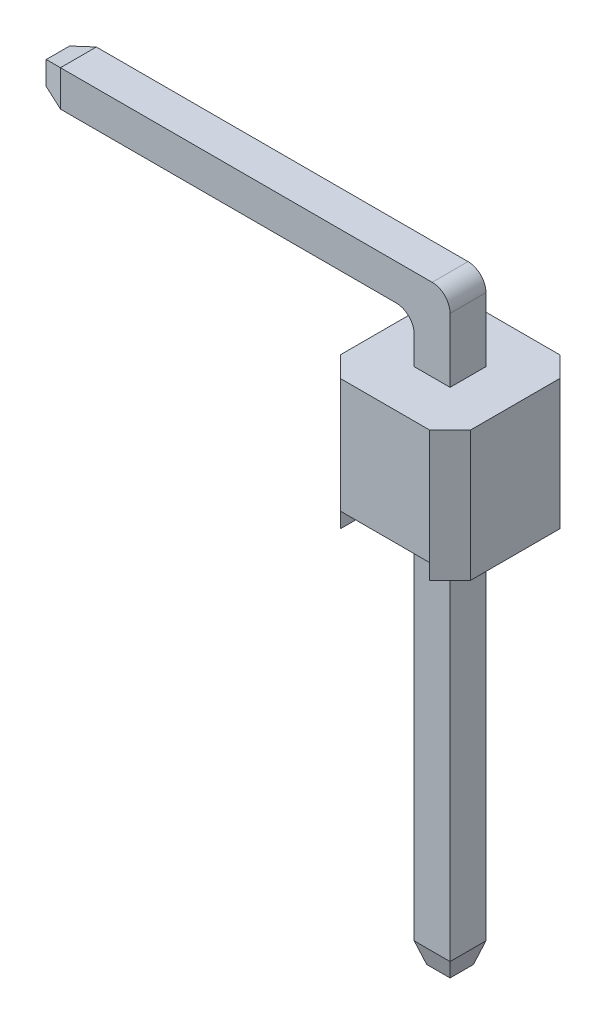
ISO-10303-21;
HEADER;
FILE_DESCRIPTION(('STEP AP214'),'2;1');
FILE_NAME('part.step','',(''),(''),'','','');
FILE_SCHEMA(('AUTOMOTIVE_DESIGN { 1 0 10303 214 1 1 1 1 }'));
ENDSEC;
DATA;
#1=APPLICATION_CONTEXT('core data for automotive mechanical design processes');
#2=APPLICATION_PROTOCOL_DEFINITION('international standard','automotive_design',2000,#1);
#3=PRODUCT_CONTEXT('',#1,'mechanical');
#4=PRODUCT('Part','Part','',(#3));
#5=PRODUCT_RELATED_PRODUCT_CATEGORY('part','',(#4));
#6=PRODUCT_DEFINITION_FORMATION('','',#4);
#7=PRODUCT_DEFINITION_CONTEXT('part definition',#1,'design');
#8=PRODUCT_DEFINITION('design','',#6,#7);
#9=PRODUCT_DEFINITION_SHAPE('','',#8);
#10=(LENGTH_UNIT() NAMED_UNIT(*) SI_UNIT(.MILLI.,.METRE.));
#11=(NAMED_UNIT(*) PLANE_ANGLE_UNIT() SI_UNIT($,.RADIAN.));
#12=(NAMED_UNIT(*) SI_UNIT($,.STERADIAN.) SOLID_ANGLE_UNIT());
#13=UNCERTAINTY_MEASURE_WITH_UNIT(LENGTH_MEASURE(1.E-05),#10,'distance_accuracy_value','');
#14=(GEOMETRIC_REPRESENTATION_CONTEXT(3) GLOBAL_UNCERTAINTY_ASSIGNED_CONTEXT((#13)) GLOBAL_UNIT_ASSIGNED_CONTEXT((#10,
#11,#12)) REPRESENTATION_CONTEXT('',''));
#15=CARTESIAN_POINT('',(0.,0.,0.));
#16=DIRECTION('',(0.,0.,1.));
#17=DIRECTION('',(1.,0.,0.));
#18=AXIS2_PLACEMENT_3D('',#15,#16,#17);
#19=CARTESIAN_POINT('',(-0.227707727417,-7.56,0.));
#20=DIRECTION('',(-0.956304755962959,-0.292371704722987,0.));
#21=DIRECTION('',(0.292371704722987,-0.956304755962959,0.));
#22=AXIS2_PLACEMENT_3D('',#19,#20,#21);
#23=PLANE('',#22);
#24=DIRECTION('',(-0.280623595141231,0.917878420979238,-0.280623595142445));
#25=VECTOR('',#24,1.);
#26=CARTESIAN_POINT('',(-0.227707727417,-7.56,-0.227707727417));
#27=LINE('',#26,#25);
#28=CARTESIAN_POINT('',(-0.227707727417,-7.56,-0.227707727417));
#29=VERTEX_POINT('',#28);
#30=CARTESIAN_POINT('',(-0.350000000000264,-7.1600000000001,-0.350000000000066));
#31=VERTEX_POINT('',#30);
#32=EDGE_CURVE('E135',#29,#31,#27,.T.);
#33=ORIENTED_EDGE('',*,*,#32,.F.);
#34=DIRECTION('',(0.,0.,-1.));
#35=VECTOR('',#34,1.);
#36=CARTESIAN_POINT('',(-0.227707727417,-7.56,0.));
#37=LINE('',#36,#35);
#38=CARTESIAN_POINT('',(-0.227707727417,-7.56,0.227707727417));
#39=VERTEX_POINT('',#38);
#40=EDGE_CURVE('E138',#39,#29,#37,.T.);
#41=ORIENTED_EDGE('',*,*,#40,.F.);
#42=DIRECTION('',(0.28062359514123,-0.917878420979238,-0.280623595142445));
#43=VECTOR('',#42,1.);
#44=CARTESIAN_POINT('',(-0.35,-7.16000000000016,0.350000000000529));
#45=LINE('',#44,#43);
#46=CARTESIAN_POINT('',(-0.350000000000264,-7.16000000000012,0.350000000000132));
#47=VERTEX_POINT('',#46);
#48=EDGE_CURVE('E152',#47,#39,#45,.T.);
#49=ORIENTED_EDGE('',*,*,#48,.F.);
#50=DIRECTION('',(0.,0.,-1.));
#51=VECTOR('',#50,1.);
#52=CARTESIAN_POINT('',(-0.35,-7.16,0.35));
#53=LINE('',#52,#51);
#54=EDGE_CURVE('E140',#47,#31,#53,.T.);
#55=ORIENTED_EDGE('',*,*,#54,.T.);
#56=EDGE_LOOP('',(#33,#41,#49,#55));
#57=FACE_BOUND('',#56,.T.);
#58=ADVANCED_FACE('F17',(#57),#23,.T.);
#59=CARTESIAN_POINT('',(0.,-7.56,-0.227707727417));
#60=DIRECTION('',(0.,-0.292371704722987,-0.956304755962959));
#61=DIRECTION('',(0.,0.956304755962959,-0.292371704722987));
#62=AXIS2_PLACEMENT_3D('',#59,#60,#61);
#63=PLANE('',#62);
#64=DIRECTION('',(0.280623595142445,0.917878420979238,-0.280623595141231));
#65=VECTOR('',#64,1.);
#66=CARTESIAN_POINT('',(0.227707727417,-7.56,-0.227707727417));
#67=LINE('',#66,#65);
#68=CARTESIAN_POINT('',(0.227707727417,-7.56,-0.227707727417));
#69=VERTEX_POINT('',#68);
#70=CARTESIAN_POINT('',(0.350000000000066,-7.1600000000001,-0.350000000000264));
#71=VERTEX_POINT('',#70);
#72=EDGE_CURVE('E156',#69,#71,#67,.T.);
#73=ORIENTED_EDGE('',*,*,#72,.F.);
#74=DIRECTION('',(1.,0.,0.));
#75=VECTOR('',#74,1.);
#76=CARTESIAN_POINT('',(0.,-7.56,-0.227707727417));
#77=LINE('',#76,#75);
#78=EDGE_CURVE('E145',#29,#69,#77,.T.);
#79=ORIENTED_EDGE('',*,*,#78,.F.);
#80=ORIENTED_EDGE('',*,*,#32,.T.);
#81=DIRECTION('',(1.,0.,0.));
#82=VECTOR('',#81,1.);
#83=CARTESIAN_POINT('',(0.35,-7.16,-0.35));
#84=LINE('',#83,#82);
#85=EDGE_CURVE('E363',#31,#71,#84,.T.);
#86=ORIENTED_EDGE('',*,*,#85,.T.);
#87=EDGE_LOOP('',(#73,#79,#80,#86));
#88=FACE_BOUND('',#87,.T.);
#89=ADVANCED_FACE('F155',(#88),#63,.T.);
#90=CARTESIAN_POINT('',(0.,-7.56,0.));
#91=DIRECTION('',(0.,-1.,0.));
#92=DIRECTION('',(0.,0.,-1.));
#93=AXIS2_PLACEMENT_3D('',#90,#91,#92);
#94=PLANE('',#93);
#95=DIRECTION('',(1.,0.,0.));
#96=VECTOR('',#95,1.);
#97=CARTESIAN_POINT('',(0.,-7.56,0.227707727417));
#98=LINE('',#97,#96);
#99=CARTESIAN_POINT('',(0.227707727417,-7.56,0.227707727417));
#100=VERTEX_POINT('',#99);
#101=EDGE_CURVE('E151',#39,#100,#98,.T.);
#102=ORIENTED_EDGE('',*,*,#101,.F.);
#103=ORIENTED_EDGE('',*,*,#40,.T.);
#104=ORIENTED_EDGE('',*,*,#78,.T.);
#105=DIRECTION('',(0.,0.,1.));
#106=VECTOR('',#105,1.);
#107=CARTESIAN_POINT('',(0.227707727417,-7.56,0.));
#108=LINE('',#107,#106);
#109=EDGE_CURVE('E357',#100,#69,#108,.F.);
#110=ORIENTED_EDGE('',*,*,#109,.F.);
#111=EDGE_LOOP('',(#102,#103,#104,#110));
#112=FACE_BOUND('',#111,.T.);
#113=ADVANCED_FACE('F148',(#112),#94,.T.);
#114=CARTESIAN_POINT('',(0.,-7.56,0.227707727417));
#115=DIRECTION('',(0.,-0.292371704722987,0.956304755962959));
#116=DIRECTION('',(0.,-0.956304755962959,-0.292371704722987));
#117=AXIS2_PLACEMENT_3D('',#114,#115,#116);
#118=PLANE('',#117);
#119=DIRECTION('',(-0.280623595142445,-0.917878420979238,-0.28062359514123));
#120=VECTOR('',#119,1.);
#121=CARTESIAN_POINT('',(0.350000000000529,-7.16000000000016,0.35));
#122=LINE('',#121,#120);
#123=CARTESIAN_POINT('',(0.350000000000132,-7.16000000000012,0.350000000000264));
#124=VERTEX_POINT('',#123);
#125=EDGE_CURVE('E359',#124,#100,#122,.T.);
#126=ORIENTED_EDGE('',*,*,#125,.F.);
#127=DIRECTION('',(-1.,0.,0.));
#128=VECTOR('',#127,1.);
#129=CARTESIAN_POINT('',(0.35,-7.16,0.35));
#130=LINE('',#129,#128);
#131=EDGE_CURVE('E352',#124,#47,#130,.T.);
#132=ORIENTED_EDGE('',*,*,#131,.T.);
#133=ORIENTED_EDGE('',*,*,#48,.T.);
#134=ORIENTED_EDGE('',*,*,#101,.T.);
#135=EDGE_LOOP('',(#126,#132,#133,#134));
#136=FACE_BOUND('',#135,.T.);
#137=ADVANCED_FACE('F377',(#136),#118,.T.);
#138=CARTESIAN_POINT('',(-0.35,-20.24994949366,0.35));
#139=DIRECTION('',(1.,0.,0.));
#140=DIRECTION('',(0.,0.,-1.));
#141=AXIS2_PLACEMENT_3D('',#138,#139,#140);
#142=PLANE('',#141);
#143=ORIENTED_EDGE('',*,*,#54,.F.);
#144=DIRECTION('',(0.,1.,0.));
#145=VECTOR('',#144,1.);
#146=CARTESIAN_POINT('',(-0.35,-20.24994949366,0.35));
#147=LINE('',#146,#145);
#148=CARTESIAN_POINT('',(-0.35,0.300000000000001,0.35));
#149=VERTEX_POINT('',#148);
#150=EDGE_CURVE('E349',#47,#149,#147,.T.);
#151=ORIENTED_EDGE('',*,*,#150,.T.);
#152=DIRECTION('',(0.,0.,-1.));
#153=VECTOR('',#152,1.);
#154=CARTESIAN_POINT('',(-0.35,0.300000000000002,0.35));
#155=LINE('',#154,#153);
#156=CARTESIAN_POINT('',(-0.35,0.300000000000001,-0.35));
#157=VERTEX_POINT('',#156);
#158=EDGE_CURVE('E372',#157,#149,#155,.F.);
#159=ORIENTED_EDGE('',*,*,#158,.F.);
#160=DIRECTION('',(0.,1.,0.));
#161=VECTOR('',#160,1.);
#162=CARTESIAN_POINT('',(-0.35,-20.24994949366,-0.35));
#163=LINE('',#162,#161);
#164=EDGE_CURVE('E365',#157,#31,#163,.F.);
#165=ORIENTED_EDGE('',*,*,#164,.T.);
#166=EDGE_LOOP('',(#143,#151,#159,#165));
#167=FACE_BOUND('',#166,.T.);
#168=ADVANCED_FACE('F382',(#167),#142,.F.);
#169=CARTESIAN_POINT('',(0.35,-20.24994949366,-0.35));
#170=DIRECTION('',(0.,0.,1.));
#171=DIRECTION('',(1.,0.,0.));
#172=AXIS2_PLACEMENT_3D('',#169,#170,#171);
#173=PLANE('',#172);
#174=ORIENTED_EDGE('',*,*,#85,.F.);
#175=ORIENTED_EDGE('',*,*,#164,.F.);
#176=DIRECTION('',(1.,0.,0.));
#177=VECTOR('',#176,1.);
#178=CARTESIAN_POINT('',(0.35,0.300000000000002,-0.35));
#179=LINE('',#178,#177);
#180=CARTESIAN_POINT('',(0.35,0.300000000000001,-0.35));
#181=VERTEX_POINT('',#180);
#182=EDGE_CURVE('E368',#181,#157,#179,.F.);
#183=ORIENTED_EDGE('',*,*,#182,.F.);
#184=DIRECTION('',(0.,1.,0.));
#185=VECTOR('',#184,1.);
#186=CARTESIAN_POINT('',(0.35,-20.24994949366,-0.35));
#187=LINE('',#186,#185);
#188=EDGE_CURVE('E346',#181,#71,#187,.F.);
#189=ORIENTED_EDGE('',*,*,#188,.T.);
#190=EDGE_LOOP('',(#174,#175,#183,#189));
#191=FACE_BOUND('',#190,.T.);
#192=ADVANCED_FACE('F385',(#191),#173,.F.);
#193=CARTESIAN_POINT('',(0.227707727417,-7.56,0.));
#194=DIRECTION('',(0.956304755962959,-0.292371704722987,0.));
#195=DIRECTION('',(0.292371704722987,0.956304755962959,0.));
#196=AXIS2_PLACEMENT_3D('',#193,#194,#195);
#197=PLANE('',#196);
#198=ORIENTED_EDGE('',*,*,#125,.T.);
#199=ORIENTED_EDGE('',*,*,#109,.T.);
#200=ORIENTED_EDGE('',*,*,#72,.T.);
#201=DIRECTION('',(0.,0.,1.));
#202=VECTOR('',#201,1.);
#203=CARTESIAN_POINT('',(0.35,-7.16,0.35));
#204=LINE('',#203,#202);
#205=EDGE_CURVE('E343',#71,#124,#204,.T.);
#206=ORIENTED_EDGE('',*,*,#205,.T.);
#207=EDGE_LOOP('',(#198,#199,#200,#206));
#208=FACE_BOUND('',#207,.T.);
#209=ADVANCED_FACE('F396',(#208),#197,.T.);
#210=CARTESIAN_POINT('',(0.35,-20.24994949366,0.35));
#211=DIRECTION('',(0.,0.,-1.));
#212=DIRECTION('',(-1.,0.,0.));
#213=AXIS2_PLACEMENT_3D('',#210,#211,#212);
#214=PLANE('',#213);
#215=ORIENTED_EDGE('',*,*,#131,.F.);
#216=DIRECTION('',(0.,1.,0.));
#217=VECTOR('',#216,1.);
#218=CARTESIAN_POINT('',(0.35,-20.24994949366,0.35));
#219=LINE('',#218,#217);
#220=CARTESIAN_POINT('',(0.35,0.300000000000001,0.35));
#221=VERTEX_POINT('',#220);
#222=EDGE_CURVE('E340',#124,#221,#219,.T.);
#223=ORIENTED_EDGE('',*,*,#222,.T.);
#224=DIRECTION('',(-1.,0.,0.));
#225=VECTOR('',#224,1.);
#226=CARTESIAN_POINT('',(0.35,0.300000000000002,0.35));
#227=LINE('',#226,#225);
#228=EDGE_CURVE('E355',#149,#221,#227,.F.);
#229=ORIENTED_EDGE('',*,*,#228,.F.);
#230=ORIENTED_EDGE('',*,*,#150,.F.);
#231=EDGE_LOOP('',(#215,#223,#229,#230));
#232=FACE_BOUND('',#231,.T.);
#233=ADVANCED_FACE('F380',(#232),#214,.F.);
#234=CARTESIAN_POINT('',(-0.87,0.3,1.27));
#235=DIRECTION('',(-1.,0.,0.));
#236=DIRECTION('',(0.,0.,1.));
#237=AXIS2_PLACEMENT_3D('',#234,#235,#236);
#238=PLANE('',#237);
#239=DIRECTION('',(0.,1.,0.));
#240=VECTOR('',#239,1.);
#241=CARTESIAN_POINT('',(-0.87,2.54,-1.27));
#242=LINE('',#241,#240);
#243=CARTESIAN_POINT('',(-0.87,0.,-1.27));
#244=VERTEX_POINT('',#243);
#245=CARTESIAN_POINT('',(-0.87,0.3,-1.27));
#246=VERTEX_POINT('',#245);
#247=EDGE_CURVE('E332',#244,#246,#242,.T.);
#248=ORIENTED_EDGE('',*,*,#247,.T.);
#249=DIRECTION('',(0.,0.,-1.));
#250=VECTOR('',#249,1.);
#251=CARTESIAN_POINT('',(-0.87,0.3,0.));
#252=LINE('',#251,#250);
#253=CARTESIAN_POINT('',(-0.87,0.3,1.27));
#254=VERTEX_POINT('',#253);
#255=EDGE_CURVE('E317',#254,#246,#252,.T.);
#256=ORIENTED_EDGE('',*,*,#255,.F.);
#257=DIRECTION('',(0.,1.,0.));
#258=VECTOR('',#257,1.);
#259=CARTESIAN_POINT('',(-0.87,2.54,1.27));
#260=LINE('',#259,#258);
#261=CARTESIAN_POINT('',(-0.87,0.,1.27));
#262=VERTEX_POINT('',#261);
#263=EDGE_CURVE('E326',#254,#262,#260,.F.);
#264=ORIENTED_EDGE('',*,*,#263,.T.);
#265=DIRECTION('',(0.,0.,1.));
#266=VECTOR('',#265,1.);
#267=CARTESIAN_POINT('',(-0.87,0.,0.));
#268=LINE('',#267,#266);
#269=EDGE_CURVE('E338',#262,#244,#268,.F.);
#270=ORIENTED_EDGE('',*,*,#269,.T.);
#271=EDGE_LOOP('',(#248,#256,#264,#270));
#272=FACE_BOUND('',#271,.T.);
#273=ADVANCED_FACE('F404',(#272),#238,.F.);
#274=CARTESIAN_POINT('',(0.35,-20.24994949366,0.35));
#275=DIRECTION('',(-1.,0.,0.));
#276=DIRECTION('',(0.,0.,1.));
#277=AXIS2_PLACEMENT_3D('',#274,#275,#276);
#278=PLANE('',#277);
#279=ORIENTED_EDGE('',*,*,#205,.F.);
#280=ORIENTED_EDGE('',*,*,#188,.F.);
#281=DIRECTION('',(0.,0.,-1.));
#282=VECTOR('',#281,1.);
#283=CARTESIAN_POINT('',(0.35,0.3,0.));
#284=LINE('',#283,#282);
#285=EDGE_CURVE('E311',#221,#181,#284,.T.);
#286=ORIENTED_EDGE('',*,*,#285,.F.);
#287=ORIENTED_EDGE('',*,*,#222,.F.);
#288=EDGE_LOOP('',(#279,#280,#286,#287));
#289=FACE_BOUND('',#288,.T.);
#290=ADVANCED_FACE('F394',(#289),#278,.F.);
#291=CARTESIAN_POINT('',(0.87,0.3,1.27));
#292=DIRECTION('',(1.,0.,0.));
#293=DIRECTION('',(0.,0.,-1.));
#294=AXIS2_PLACEMENT_3D('',#291,#292,#293);
#295=PLANE('',#294);
#296=DIRECTION('',(0.,1.,0.));
#297=VECTOR('',#296,1.);
#298=CARTESIAN_POINT('',(0.87,2.54,1.27));
#299=LINE('',#298,#297);
#300=CARTESIAN_POINT('',(0.87,0.,1.27));
#301=VERTEX_POINT('',#300);
#302=CARTESIAN_POINT('',(0.87,0.3,1.27));
#303=VERTEX_POINT('',#302);
#304=EDGE_CURVE('E308',#301,#303,#299,.T.);
#305=ORIENTED_EDGE('',*,*,#304,.T.);
#306=DIRECTION('',(0.,0.,-1.));
#307=VECTOR('',#306,1.);
#308=CARTESIAN_POINT('',(0.87,0.3,0.));
#309=LINE('',#308,#307);
#310=CARTESIAN_POINT('',(0.87,0.3,-1.27));
#311=VERTEX_POINT('',#310);
#312=EDGE_CURVE('E314',#311,#303,#309,.F.);
#313=ORIENTED_EDGE('',*,*,#312,.F.);
#314=DIRECTION('',(0.,1.,0.));
#315=VECTOR('',#314,1.);
#316=CARTESIAN_POINT('',(0.87,2.54,-1.27));
#317=LINE('',#316,#315);
#318=CARTESIAN_POINT('',(0.87,0.,-1.27));
#319=VERTEX_POINT('',#318);
#320=EDGE_CURVE('E303',#311,#319,#317,.F.);
#321=ORIENTED_EDGE('',*,*,#320,.T.);
#322=DIRECTION('',(0.,0.,1.));
#323=VECTOR('',#322,1.);
#324=CARTESIAN_POINT('',(0.87,0.,0.));
#325=LINE('',#324,#323);
#326=EDGE_CURVE('E295',#319,#301,#325,.T.);
#327=ORIENTED_EDGE('',*,*,#326,.T.);
#328=EDGE_LOOP('',(#305,#313,#321,#327));
#329=FACE_BOUND('',#328,.T.);
#330=ADVANCED_FACE('F504',(#329),#295,.F.);
#331=CARTESIAN_POINT('',(0.,0.,0.));
#332=DIRECTION('',(0.,1.,0.));
#333=DIRECTION('',(0.,0.,1.));
#334=AXIS2_PLACEMENT_3D('',#331,#332,#333);
#335=PLANE('',#334);
#336=ORIENTED_EDGE('',*,*,#269,.F.);
#337=DIRECTION('',(-0.707106781186548,0.,-0.707106781186548));
#338=VECTOR('',#337,1.);
#339=CARTESIAN_POINT('',(-0.87,0.,1.27));
#340=LINE('',#339,#338);
#341=CARTESIAN_POINT('',(-1.27,0.,0.87));
#342=VERTEX_POINT('',#341);
#343=EDGE_CURVE('E323',#262,#342,#340,.T.);
#344=ORIENTED_EDGE('',*,*,#343,.T.);
#345=DIRECTION('',(0.,0.,-1.));
#346=VECTOR('',#345,1.);
#347=CARTESIAN_POINT('',(-1.27,0.,-1.27));
#348=LINE('',#347,#346);
#349=CARTESIAN_POINT('',(-1.27,0.,-0.87));
#350=VERTEX_POINT('',#349);
#351=EDGE_CURVE('E274',#342,#350,#348,.T.);
#352=ORIENTED_EDGE('',*,*,#351,.T.);
#353=DIRECTION('',(0.707106781186548,0.,-0.707106781186548));
#354=VECTOR('',#353,1.);
#355=CARTESIAN_POINT('',(-1.27,0.,-0.87));
#356=LINE('',#355,#354);
#357=EDGE_CURVE('E335',#350,#244,#356,.T.);
#358=ORIENTED_EDGE('',*,*,#357,.T.);
#359=EDGE_LOOP('',(#336,#344,#352,#358));
#360=FACE_BOUND('',#359,.T.);
#361=ADVANCED_FACE('F500',(#360),#335,.F.);
#362=CARTESIAN_POINT('',(-1.27,2.54,-0.87));
#363=DIRECTION('',(0.707106781186548,0.,0.707106781186548));
#364=DIRECTION('',(0.707106781186548,0.,-0.707106781186548));
#365=AXIS2_PLACEMENT_3D('',#362,#363,#364);
#366=PLANE('',#365);
#367=DIRECTION('',(0.,1.,0.));
#368=VECTOR('',#367,1.);
#369=CARTESIAN_POINT('',(-0.87,2.54,-1.27));
#370=LINE('',#369,#368);
#371=CARTESIAN_POINT('',(-0.87,2.54,-1.27));
#372=VERTEX_POINT('',#371);
#373=EDGE_CURVE('E283',#372,#246,#370,.F.);
#374=ORIENTED_EDGE('',*,*,#373,.T.);
#375=ORIENTED_EDGE('',*,*,#247,.F.);
#376=ORIENTED_EDGE('',*,*,#357,.F.);
#377=DIRECTION('',(0.,1.,0.));
#378=VECTOR('',#377,1.);
#379=CARTESIAN_POINT('',(-1.27,2.54,-0.87));
#380=LINE('',#379,#378);
#381=CARTESIAN_POINT('',(-1.27,2.54,-0.87));
#382=VERTEX_POINT('',#381);
#383=EDGE_CURVE('E271',#350,#382,#380,.T.);
#384=ORIENTED_EDGE('',*,*,#383,.T.);
#385=DIRECTION('',(0.707106781186548,0.,-0.707106781186548));
#386=VECTOR('',#385,1.);
#387=CARTESIAN_POINT('',(-1.27,2.54,-0.87));
#388=LINE('',#387,#386);
#389=EDGE_CURVE('E329',#372,#382,#388,.F.);
#390=ORIENTED_EDGE('',*,*,#389,.F.);
#391=EDGE_LOOP('',(#374,#375,#376,#384,#390));
#392=FACE_BOUND('',#391,.T.);
#393=ADVANCED_FACE('F496',(#392),#366,.F.);
#394=CARTESIAN_POINT('',(-0.87,2.54,1.27));
#395=DIRECTION('',(0.707106781186548,0.,-0.707106781186548));
#396=DIRECTION('',(-0.707106781186548,0.,-0.707106781186548));
#397=AXIS2_PLACEMENT_3D('',#394,#395,#396);
#398=PLANE('',#397);
#399=DIRECTION('',(0.,1.,0.));
#400=VECTOR('',#399,1.);
#401=CARTESIAN_POINT('',(-1.27,2.54,0.87));
#402=LINE('',#401,#400);
#403=CARTESIAN_POINT('',(-1.27,2.54,0.87));
#404=VERTEX_POINT('',#403);
#405=EDGE_CURVE('E277',#404,#342,#402,.F.);
#406=ORIENTED_EDGE('',*,*,#405,.T.);
#407=ORIENTED_EDGE('',*,*,#343,.F.);
#408=ORIENTED_EDGE('',*,*,#263,.F.);
#409=DIRECTION('',(0.,1.,0.));
#410=VECTOR('',#409,1.);
#411=CARTESIAN_POINT('',(-0.87,2.54,1.27));
#412=LINE('',#411,#410);
#413=CARTESIAN_POINT('',(-0.87,2.54,1.27));
#414=VERTEX_POINT('',#413);
#415=EDGE_CURVE('E268',#254,#414,#412,.T.);
#416=ORIENTED_EDGE('',*,*,#415,.T.);
#417=DIRECTION('',(-0.707106781186548,0.,-0.707106781186548));
#418=VECTOR('',#417,1.);
#419=CARTESIAN_POINT('',(-0.87,2.54,1.27));
#420=LINE('',#419,#418);
#421=EDGE_CURVE('E320',#404,#414,#420,.F.);
#422=ORIENTED_EDGE('',*,*,#421,.F.);
#423=EDGE_LOOP('',(#406,#407,#408,#416,#422));
#424=FACE_BOUND('',#423,.T.);
#425=ADVANCED_FACE('F493',(#424),#398,.F.);
#426=CARTESIAN_POINT('',(0.,0.3,0.));
#427=DIRECTION('',(0.,-1.,0.));
#428=DIRECTION('',(0.,0.,-1.));
#429=AXIS2_PLACEMENT_3D('',#426,#427,#428);
#430=PLANE('',#429);
#431=ORIENTED_EDGE('',*,*,#228,.T.);
#432=ORIENTED_EDGE('',*,*,#285,.T.);
#433=ORIENTED_EDGE('',*,*,#182,.T.);
#434=ORIENTED_EDGE('',*,*,#158,.T.);
#435=EDGE_LOOP('',(#431,#432,#433,#434));
#436=FACE_BOUND('',#435,.T.);
#437=ORIENTED_EDGE('',*,*,#312,.T.);
#438=DIRECTION('',(-1.,0.,0.));
#439=VECTOR('',#438,1.);
#440=CARTESIAN_POINT('',(-1.27,0.3,1.27));
#441=LINE('',#440,#439);
#442=EDGE_CURVE('E262',#303,#254,#441,.T.);
#443=ORIENTED_EDGE('',*,*,#442,.T.);
#444=ORIENTED_EDGE('',*,*,#255,.T.);
#445=DIRECTION('',(1.,0.,0.));
#446=VECTOR('',#445,1.);
#447=CARTESIAN_POINT('',(-1.27,0.3,-1.27));
#448=LINE('',#447,#446);
#449=EDGE_CURVE('E280',#246,#311,#448,.T.);
#450=ORIENTED_EDGE('',*,*,#449,.T.);
#451=EDGE_LOOP('',(#437,#443,#444,#450));
#452=FACE_BOUND('',#451,.T.);
#453=ADVANCED_FACE('F388',(#436,#452),#430,.T.);
#454=CARTESIAN_POINT('',(1.27,2.54,0.87));
#455=DIRECTION('',(-0.707106781186548,0.,-0.707106781186548));
#456=DIRECTION('',(-0.707106781186548,0.,0.707106781186548));
#457=AXIS2_PLACEMENT_3D('',#454,#455,#456);
#458=PLANE('',#457);
#459=DIRECTION('',(0.,1.,0.));
#460=VECTOR('',#459,1.);
#461=CARTESIAN_POINT('',(0.87,2.54,1.27));
#462=LINE('',#461,#460);
#463=CARTESIAN_POINT('',(0.87,2.54,1.27));
#464=VERTEX_POINT('',#463);
#465=EDGE_CURVE('E265',#464,#303,#462,.F.);
#466=ORIENTED_EDGE('',*,*,#465,.T.);
#467=ORIENTED_EDGE('',*,*,#304,.F.);
#468=DIRECTION('',(0.707106781186548,0.,-0.707106781186548));
#469=VECTOR('',#468,1.);
#470=CARTESIAN_POINT('',(0.87,0.,1.27));
#471=LINE('',#470,#469);
#472=CARTESIAN_POINT('',(1.27,0.,0.87));
#473=VERTEX_POINT('',#472);
#474=EDGE_CURVE('E289',#301,#473,#471,.T.);
#475=ORIENTED_EDGE('',*,*,#474,.T.);
#476=DIRECTION('',(0.,1.,0.));
#477=VECTOR('',#476,1.);
#478=CARTESIAN_POINT('',(1.27,2.54,0.87));
#479=LINE('',#478,#477);
#480=CARTESIAN_POINT('',(1.27,2.54,0.87));
#481=VERTEX_POINT('',#480);
#482=EDGE_CURVE('E259',#473,#481,#479,.T.);
#483=ORIENTED_EDGE('',*,*,#482,.T.);
#484=DIRECTION('',(-0.707106781186548,0.,0.707106781186548));
#485=VECTOR('',#484,1.);
#486=CARTESIAN_POINT('',(1.27,2.54,0.87));
#487=LINE('',#486,#485);
#488=EDGE_CURVE('E305',#464,#481,#487,.F.);
#489=ORIENTED_EDGE('',*,*,#488,.F.);
#490=EDGE_LOOP('',(#466,#467,#475,#483,#489));
#491=FACE_BOUND('',#490,.T.);
#492=ADVANCED_FACE('F486',(#491),#458,.F.);
#493=CARTESIAN_POINT('',(0.87,2.54,-1.27));
#494=DIRECTION('',(-0.707106781186548,0.,0.707106781186548));
#495=DIRECTION('',(0.707106781186548,0.,0.707106781186548));
#496=AXIS2_PLACEMENT_3D('',#493,#494,#495);
#497=PLANE('',#496);
#498=DIRECTION('',(0.,1.,0.));
#499=VECTOR('',#498,1.);
#500=CARTESIAN_POINT('',(1.27,2.54,-0.87));
#501=LINE('',#500,#499);
#502=CARTESIAN_POINT('',(1.27,2.54,-0.87));
#503=VERTEX_POINT('',#502);
#504=CARTESIAN_POINT('',(1.27,0.,-0.87));
#505=VERTEX_POINT('',#504);
#506=EDGE_CURVE('E256',#503,#505,#501,.F.);
#507=ORIENTED_EDGE('',*,*,#506,.T.);
#508=DIRECTION('',(-0.707106781186548,0.,-0.707106781186548));
#509=VECTOR('',#508,1.);
#510=CARTESIAN_POINT('',(1.27,0.,-0.87));
#511=LINE('',#510,#509);
#512=EDGE_CURVE('E298',#505,#319,#511,.T.);
#513=ORIENTED_EDGE('',*,*,#512,.T.);
#514=ORIENTED_EDGE('',*,*,#320,.F.);
#515=DIRECTION('',(0.,1.,0.));
#516=VECTOR('',#515,1.);
#517=CARTESIAN_POINT('',(0.87,2.54,-1.27));
#518=LINE('',#517,#516);
#519=CARTESIAN_POINT('',(0.87,2.54,-1.27));
#520=VERTEX_POINT('',#519);
#521=EDGE_CURVE('E286',#311,#520,#518,.T.);
#522=ORIENTED_EDGE('',*,*,#521,.T.);
#523=DIRECTION('',(0.707106781186548,0.,0.707106781186548));
#524=VECTOR('',#523,1.);
#525=CARTESIAN_POINT('',(0.87,2.54,-1.27));
#526=LINE('',#525,#524);
#527=EDGE_CURVE('E301',#503,#520,#526,.F.);
#528=ORIENTED_EDGE('',*,*,#527,.F.);
#529=EDGE_LOOP('',(#507,#513,#514,#522,#528));
#530=FACE_BOUND('',#529,.T.);
#531=ADVANCED_FACE('F482',(#530),#497,.F.);
#532=CARTESIAN_POINT('',(0.,0.,0.));
#533=DIRECTION('',(0.,1.,0.));
#534=DIRECTION('',(0.,0.,1.));
#535=AXIS2_PLACEMENT_3D('',#532,#533,#534);
#536=PLANE('',#535);
#537=ORIENTED_EDGE('',*,*,#326,.F.);
#538=ORIENTED_EDGE('',*,*,#512,.F.);
#539=DIRECTION('',(0.,0.,1.));
#540=VECTOR('',#539,1.);
#541=CARTESIAN_POINT('',(1.27,0.,-1.27));
#542=LINE('',#541,#540);
#543=EDGE_CURVE('E249',#505,#473,#542,.T.);
#544=ORIENTED_EDGE('',*,*,#543,.T.);
#545=ORIENTED_EDGE('',*,*,#474,.F.);
#546=EDGE_LOOP('',(#537,#538,#544,#545));
#547=FACE_BOUND('',#546,.T.);
#548=ADVANCED_FACE('F478',(#547),#536,.F.);
#549=CARTESIAN_POINT('',(-7.65,0.,-0.227707727417));
#550=DIRECTION('',(-0.292371704722987,0.,-0.956304755962959));
#551=DIRECTION('',(-0.956304755962959,0.,0.292371704722987));
#552=AXIS2_PLACEMENT_3D('',#549,#550,#551);
#553=PLANE('',#552);
#554=DIRECTION('',(-0.917878420979239,-0.280623595142444,0.28062359514123));
#555=VECTOR('',#554,1.);
#556=CARTESIAN_POINT('',(-7.25000000000016,4.14000000000053,-0.35));
#557=LINE('',#556,#555);
#558=CARTESIAN_POINT('',(-7.25000000000004,4.14000000000013,-0.35));
#559=VERTEX_POINT('',#558);
#560=CARTESIAN_POINT('',(-7.65,4.017707727417,-0.227707727417));
#561=VERTEX_POINT('',#560);
#562=EDGE_CURVE('E75',#559,#561,#557,.T.);
#563=ORIENTED_EDGE('',*,*,#562,.F.);
#564=DIRECTION('',(0.,1.,0.));
#565=VECTOR('',#564,1.);
#566=CARTESIAN_POINT('',(-7.25,4.14,-0.35));
#567=LINE('',#566,#565);
#568=CARTESIAN_POINT('',(-7.25000000000004,3.43999999999987,-0.35));
#569=VERTEX_POINT('',#568);
#570=EDGE_CURVE('E216',#559,#569,#567,.F.);
#571=ORIENTED_EDGE('',*,*,#570,.T.);
#572=DIRECTION('',(0.917878420979238,-0.280623595142445,-0.28062359514123));
#573=VECTOR('',#572,1.);
#574=CARTESIAN_POINT('',(-7.65,3.562292272583,-0.227707727417));
#575=LINE('',#574,#573);
#576=CARTESIAN_POINT('',(-7.65,3.562292272583,-0.227707727417));
#577=VERTEX_POINT('',#576);
#578=EDGE_CURVE('E247',#577,#569,#575,.T.);
#579=ORIENTED_EDGE('',*,*,#578,.F.);
#580=DIRECTION('',(0.,1.,0.));
#581=VECTOR('',#580,1.);
#582=CARTESIAN_POINT('',(-7.65,0.,-0.227707727417));
#583=LINE('',#582,#581);
#584=EDGE_CURVE('E239',#561,#577,#583,.F.);
#585=ORIENTED_EDGE('',*,*,#584,.F.);
#586=EDGE_LOOP('',(#563,#571,#579,#585));
#587=FACE_BOUND('',#586,.T.);
#588=ADVANCED_FACE('F474',(#587),#553,.T.);
#589=CARTESIAN_POINT('',(-1.27,2.54,-1.27));
#590=DIRECTION('',(0.,0.,1.));
#591=DIRECTION('',(1.,0.,0.));
#592=AXIS2_PLACEMENT_3D('',#589,#590,#591);
#593=PLANE('',#592);
#594=ORIENTED_EDGE('',*,*,#373,.F.);
#595=DIRECTION('',(1.,0.,0.));
#596=VECTOR('',#595,1.);
#597=CARTESIAN_POINT('',(0.,2.54,-1.27));
#598=LINE('',#597,#596);
#599=EDGE_CURVE('E201',#520,#372,#598,.F.);
#600=ORIENTED_EDGE('',*,*,#599,.F.);
#601=ORIENTED_EDGE('',*,*,#521,.F.);
#602=ORIENTED_EDGE('',*,*,#449,.F.);
#603=EDGE_LOOP('',(#594,#600,#601,#602));
#604=FACE_BOUND('',#603,.T.);
#605=ADVANCED_FACE('F470',(#604),#593,.F.);
#606=CARTESIAN_POINT('',(-1.27,2.54,-1.27));
#607=DIRECTION('',(1.,0.,0.));
#608=DIRECTION('',(0.,0.,-1.));
#609=AXIS2_PLACEMENT_3D('',#606,#607,#608);
#610=PLANE('',#609);
#611=ORIENTED_EDGE('',*,*,#383,.F.);
#612=ORIENTED_EDGE('',*,*,#351,.F.);
#613=ORIENTED_EDGE('',*,*,#405,.F.);
#614=DIRECTION('',(0.,0.,1.));
#615=VECTOR('',#614,1.);
#616=CARTESIAN_POINT('',(-1.27,2.54,0.));
#617=LINE('',#616,#615);
#618=EDGE_CURVE('E198',#382,#404,#617,.T.);
#619=ORIENTED_EDGE('',*,*,#618,.F.);
#620=EDGE_LOOP('',(#611,#612,#613,#619));
#621=FACE_BOUND('',#620,.T.);
#622=ADVANCED_FACE('F466',(#621),#610,.F.);
#623=CARTESIAN_POINT('',(-1.27,2.54,1.27));
#624=DIRECTION('',(0.,0.,-1.));
#625=DIRECTION('',(-1.,0.,0.));
#626=AXIS2_PLACEMENT_3D('',#623,#624,#625);
#627=PLANE('',#626);
#628=ORIENTED_EDGE('',*,*,#465,.F.);
#629=DIRECTION('',(1.,0.,0.));
#630=VECTOR('',#629,1.);
#631=CARTESIAN_POINT('',(0.,2.54,1.27));
#632=LINE('',#631,#630);
#633=EDGE_CURVE('E195',#414,#464,#632,.T.);
#634=ORIENTED_EDGE('',*,*,#633,.F.);
#635=ORIENTED_EDGE('',*,*,#415,.F.);
#636=ORIENTED_EDGE('',*,*,#442,.F.);
#637=EDGE_LOOP('',(#628,#634,#635,#636));
#638=FACE_BOUND('',#637,.T.);
#639=ADVANCED_FACE('F462',(#638),#627,.F.);
#640=CARTESIAN_POINT('',(1.27,2.54,-1.27));
#641=DIRECTION('',(-1.,0.,0.));
#642=DIRECTION('',(0.,0.,1.));
#643=AXIS2_PLACEMENT_3D('',#640,#641,#642);
#644=PLANE('',#643);
#645=ORIENTED_EDGE('',*,*,#506,.F.);
#646=DIRECTION('',(0.,0.,1.));
#647=VECTOR('',#646,1.);
#648=CARTESIAN_POINT('',(1.27,2.54,0.));
#649=LINE('',#648,#647);
#650=EDGE_CURVE('E192',#481,#503,#649,.F.);
#651=ORIENTED_EDGE('',*,*,#650,.F.);
#652=ORIENTED_EDGE('',*,*,#482,.F.);
#653=ORIENTED_EDGE('',*,*,#543,.F.);
#654=EDGE_LOOP('',(#645,#651,#652,#653));
#655=FACE_BOUND('',#654,.T.);
#656=ADVANCED_FACE('F458',(#655),#644,.F.);
#657=CARTESIAN_POINT('',(-7.65,3.562292272583,0.));
#658=DIRECTION('',(-0.292371704722987,-0.956304755962959,0.));
#659=DIRECTION('',(0.956304755962959,-0.292371704722987,0.));
#660=AXIS2_PLACEMENT_3D('',#657,#658,#659);
#661=PLANE('',#660);
#662=DIRECTION('',(0.917878420979238,-0.28062359514123,0.280623595142445));
#663=VECTOR('',#662,1.);
#664=CARTESIAN_POINT('',(-7.65,3.562292272583,0.227707727417));
#665=LINE('',#664,#663);
#666=CARTESIAN_POINT('',(-7.65,3.562292272583,0.227707727417));
#667=VERTEX_POINT('',#666);
#668=CARTESIAN_POINT('',(-7.25000000000004,3.44,0.350000000000134));
#669=VERTEX_POINT('',#668);
#670=EDGE_CURVE('E244',#667,#669,#665,.T.);
#671=ORIENTED_EDGE('',*,*,#670,.F.);
#672=DIRECTION('',(0.,0.,1.));
#673=VECTOR('',#672,1.);
#674=CARTESIAN_POINT('',(-7.65,3.562292272583,0.));
#675=LINE('',#674,#673);
#676=EDGE_CURVE('E225',#577,#667,#675,.T.);
#677=ORIENTED_EDGE('',*,*,#676,.F.);
#678=ORIENTED_EDGE('',*,*,#578,.T.);
#679=DIRECTION('',(0.,0.,1.));
#680=VECTOR('',#679,1.);
#681=CARTESIAN_POINT('',(-7.25,3.44,-0.35));
#682=LINE('',#681,#680);
#683=EDGE_CURVE('E168',#569,#669,#682,.T.);
#684=ORIENTED_EDGE('',*,*,#683,.T.);
#685=EDGE_LOOP('',(#671,#677,#678,#684));
#686=FACE_BOUND('',#685,.T.);
#687=ADVANCED_FACE('F454',(#686),#661,.T.);
#688=CARTESIAN_POINT('',(-7.65,0.,0.));
#689=DIRECTION('',(-1.,0.,0.));
#690=DIRECTION('',(0.,0.,1.));
#691=AXIS2_PLACEMENT_3D('',#688,#689,#690);
#692=PLANE('',#691);
#693=ORIENTED_EDGE('',*,*,#584,.T.);
#694=ORIENTED_EDGE('',*,*,#676,.T.);
#695=DIRECTION('',(0.,1.,0.));
#696=VECTOR('',#695,1.);
#697=CARTESIAN_POINT('',(-7.65,0.,0.227707727417));
#698=LINE('',#697,#696);
#699=CARTESIAN_POINT('',(-7.65,4.017707727417,0.227707727417));
#700=VERTEX_POINT('',#699);
#701=EDGE_CURVE('E231',#700,#667,#698,.F.);
#702=ORIENTED_EDGE('',*,*,#701,.F.);
#703=DIRECTION('',(0.,0.,1.));
#704=VECTOR('',#703,1.);
#705=CARTESIAN_POINT('',(-7.65,4.017707727417,0.));
#706=LINE('',#705,#704);
#707=EDGE_CURVE('E221',#561,#700,#706,.T.);
#708=ORIENTED_EDGE('',*,*,#707,.F.);
#709=EDGE_LOOP('',(#693,#694,#702,#708));
#710=FACE_BOUND('',#709,.T.);
#711=ADVANCED_FACE('F451',(#710),#692,.T.);
#712=CARTESIAN_POINT('',(-7.65,4.017707727417,0.));
#713=DIRECTION('',(-0.292371704722987,0.956304755962959,0.));
#714=DIRECTION('',(-0.956304755962959,-0.292371704722987,0.));
#715=AXIS2_PLACEMENT_3D('',#712,#713,#714);
#716=PLANE('',#715);
#717=ORIENTED_EDGE('',*,*,#562,.T.);
#718=ORIENTED_EDGE('',*,*,#707,.T.);
#719=DIRECTION('',(-0.917878420979239,-0.280623595141228,-0.280623595142445));
#720=VECTOR('',#719,1.);
#721=CARTESIAN_POINT('',(-7.25000000000016,4.14,0.350000000000529));
#722=LINE('',#721,#720);
#723=CARTESIAN_POINT('',(-7.25000000000004,4.14,0.350000000000134));
#724=VERTEX_POINT('',#723);
#725=EDGE_CURVE('E234',#724,#700,#722,.T.);
#726=ORIENTED_EDGE('',*,*,#725,.F.);
#727=DIRECTION('',(0.,0.,-1.));
#728=VECTOR('',#727,1.);
#729=CARTESIAN_POINT('',(-7.25,4.14,0.));
#730=LINE('',#729,#728);
#731=EDGE_CURVE('E211',#724,#559,#730,.T.);
#732=ORIENTED_EDGE('',*,*,#731,.T.);
#733=EDGE_LOOP('',(#717,#718,#726,#732));
#734=FACE_BOUND('',#733,.T.);
#735=ADVANCED_FACE('F448',(#734),#716,.T.);
#736=CARTESIAN_POINT('',(0.35,4.14,-0.35));
#737=DIRECTION('',(0.,0.,1.));
#738=DIRECTION('',(1.,0.,0.));
#739=AXIS2_PLACEMENT_3D('',#736,#737,#738);
#740=PLANE('',#739);
#741=CARTESIAN_POINT('',(0.,3.79,-0.35));
#742=DIRECTION('',(0.,0.,-1.));
#743=DIRECTION('',(-1.,0.,0.));
#744=AXIS2_PLACEMENT_3D('',#741,#742,#743);
#745=CIRCLE('',#744,0.35);
#746=CARTESIAN_POINT('',(0.35,3.79,-0.35));
#747=VERTEX_POINT('',#746);
#748=CARTESIAN_POINT('',(0.,4.14,-0.35));
#749=VERTEX_POINT('',#748);
#750=EDGE_CURVE('E20',#747,#749,#745,.F.);
#751=ORIENTED_EDGE('',*,*,#750,.F.);
#752=DIRECTION('',(0.,1.,0.));
#753=VECTOR('',#752,1.);
#754=CARTESIAN_POINT('',(0.35,4.14,-0.35));
#755=LINE('',#754,#753);
#756=CARTESIAN_POINT('',(0.35,2.54,-0.35));
#757=VERTEX_POINT('',#756);
#758=EDGE_CURVE('E214',#757,#747,#755,.T.);
#759=ORIENTED_EDGE('',*,*,#758,.F.);
#760=DIRECTION('',(1.,0.,0.));
#761=VECTOR('',#760,1.);
#762=CARTESIAN_POINT('',(0.,2.54,-0.35));
#763=LINE('',#762,#761);
#764=CARTESIAN_POINT('',(-0.35,2.54,-0.35));
#765=VERTEX_POINT('',#764);
#766=EDGE_CURVE('E189',#765,#757,#763,.T.);
#767=ORIENTED_EDGE('',*,*,#766,.F.);
#768=DIRECTION('',(0.,1.,0.));
#769=VECTOR('',#768,1.);
#770=CARTESIAN_POINT('',(-0.35,4.14,-0.35));
#771=LINE('',#770,#769);
#772=CARTESIAN_POINT('',(-0.35,3.09,-0.35));
#773=VERTEX_POINT('',#772);
#774=EDGE_CURVE('E177',#765,#773,#771,.T.);
#775=ORIENTED_EDGE('',*,*,#774,.T.);
#776=CARTESIAN_POINT('',(-0.7,3.09,-0.35));
#777=DIRECTION('',(0.,0.,-1.));
#778=DIRECTION('',(-1.,0.,0.));
#779=AXIS2_PLACEMENT_3D('',#776,#777,#778);
#780=CIRCLE('',#779,0.35);
#781=CARTESIAN_POINT('',(-0.7,3.44,-0.35));
#782=VERTEX_POINT('',#781);
#783=EDGE_CURVE('E167',#773,#782,#780,.F.);
#784=ORIENTED_EDGE('',*,*,#783,.T.);
#785=DIRECTION('',(1.,0.,0.));
#786=VECTOR('',#785,1.);
#787=CARTESIAN_POINT('',(-7.65,3.44,-0.35));
#788=LINE('',#787,#786);
#789=EDGE_CURVE('E242',#782,#569,#788,.F.);
#790=ORIENTED_EDGE('',*,*,#789,.T.);
#791=ORIENTED_EDGE('',*,*,#570,.F.);
#792=DIRECTION('',(1.,0.,0.));
#793=VECTOR('',#792,1.);
#794=CARTESIAN_POINT('',(0.,4.14,-0.35));
#795=LINE('',#794,#793);
#796=EDGE_CURVE('E208',#559,#749,#795,.T.);
#797=ORIENTED_EDGE('',*,*,#796,.T.);
#798=EDGE_LOOP('',(#751,#759,#767,#775,#784,#790,#791,#797));
#799=FACE_BOUND('',#798,.T.);
#800=ADVANCED_FACE('F444',(#799),#740,.F.);
#801=CARTESIAN_POINT('',(0.,2.54,0.));
#802=DIRECTION('',(0.,1.,0.));
#803=DIRECTION('',(0.,0.,1.));
#804=AXIS2_PLACEMENT_3D('',#801,#802,#803);
#805=PLANE('',#804);
#806=ORIENTED_EDGE('',*,*,#766,.T.);
#807=DIRECTION('',(0.,0.,1.));
#808=VECTOR('',#807,1.);
#809=CARTESIAN_POINT('',(0.35,2.54,-0.35));
#810=LINE('',#809,#808);
#811=CARTESIAN_POINT('',(0.35,2.54,0.35));
#812=VERTEX_POINT('',#811);
#813=EDGE_CURVE('E575',#757,#812,#810,.T.);
#814=ORIENTED_EDGE('',*,*,#813,.T.);
#815=DIRECTION('',(-1.,0.,0.));
#816=VECTOR('',#815,1.);
#817=CARTESIAN_POINT('',(0.35,2.54,0.35));
#818=LINE('',#817,#816);
#819=CARTESIAN_POINT('',(-0.35,2.54,0.35));
#820=VERTEX_POINT('',#819);
#821=EDGE_CURVE('E613',#812,#820,#818,.T.);
#822=ORIENTED_EDGE('',*,*,#821,.T.);
#823=DIRECTION('',(0.,0.,-1.));
#824=VECTOR('',#823,1.);
#825=CARTESIAN_POINT('',(-0.35,2.54,-0.35));
#826=LINE('',#825,#824);
#827=EDGE_CURVE('E182',#820,#765,#826,.T.);
#828=ORIENTED_EDGE('',*,*,#827,.T.);
#829=EDGE_LOOP('',(#806,#814,#822,#828));
#830=FACE_BOUND('',#829,.T.);
#831=ORIENTED_EDGE('',*,*,#650,.T.);
#832=ORIENTED_EDGE('',*,*,#527,.T.);
#833=ORIENTED_EDGE('',*,*,#599,.T.);
#834=ORIENTED_EDGE('',*,*,#389,.T.);
#835=ORIENTED_EDGE('',*,*,#618,.T.);
#836=ORIENTED_EDGE('',*,*,#421,.T.);
#837=ORIENTED_EDGE('',*,*,#633,.T.);
#838=ORIENTED_EDGE('',*,*,#488,.T.);
#839=EDGE_LOOP('',(#831,#832,#833,#834,#835,#836,#837,#838));
#840=FACE_BOUND('',#839,.T.);
#841=ADVANCED_FACE('F441',(#830,#840),#805,.T.);
#842=CARTESIAN_POINT('',(-0.35,4.14,-0.35));
#843=DIRECTION('',(1.,0.,0.));
#844=DIRECTION('',(0.,0.,-1.));
#845=AXIS2_PLACEMENT_3D('',#842,#843,#844);
#846=PLANE('',#845);
#847=DIRECTION('',(0.,0.,-1.));
#848=VECTOR('',#847,1.);
#849=CARTESIAN_POINT('',(-0.35,3.09,-0.35));
#850=LINE('',#849,#848);
#851=CARTESIAN_POINT('',(-0.35,3.09,0.35));
#852=VERTEX_POINT('',#851);
#853=EDGE_CURVE('E169',#852,#773,#850,.T.);
#854=ORIENTED_EDGE('',*,*,#853,.T.);
#855=ORIENTED_EDGE('',*,*,#774,.F.);
#856=ORIENTED_EDGE('',*,*,#827,.F.);
#857=DIRECTION('',(0.,1.,0.));
#858=VECTOR('',#857,1.);
#859=CARTESIAN_POINT('',(-0.35,4.14,0.35));
#860=LINE('',#859,#858);
#861=EDGE_CURVE('E166',#820,#852,#860,.T.);
#862=ORIENTED_EDGE('',*,*,#861,.T.);
#863=EDGE_LOOP('',(#854,#855,#856,#862));
#864=FACE_BOUND('',#863,.T.);
#865=ADVANCED_FACE('F437',(#864),#846,.F.);
#866=CARTESIAN_POINT('',(-0.7,3.09,-0.35));
#867=DIRECTION('',(0.,0.,-1.));
#868=DIRECTION('',(-1.,0.,0.));
#869=AXIS2_PLACEMENT_3D('',#866,#867,#868);
#870=CYLINDRICAL_SURFACE('',#869,0.35);
#871=ORIENTED_EDGE('',*,*,#853,.F.);
#872=CARTESIAN_POINT('',(-0.7,3.09,0.35));
#873=DIRECTION('',(0.,0.,-1.));
#874=DIRECTION('',(-1.,0.,0.));
#875=AXIS2_PLACEMENT_3D('',#872,#873,#874);
#876=CIRCLE('',#875,0.35);
#877=CARTESIAN_POINT('',(-0.7,3.44,0.35));
#878=VERTEX_POINT('',#877);
#879=EDGE_CURVE('E163',#852,#878,#876,.F.);
#880=ORIENTED_EDGE('',*,*,#879,.T.);
#881=DIRECTION('',(0.,0.,1.));
#882=VECTOR('',#881,1.);
#883=CARTESIAN_POINT('',(-0.7,3.44,-0.35));
#884=LINE('',#883,#882);
#885=EDGE_CURVE('E174',#878,#782,#884,.F.);
#886=ORIENTED_EDGE('',*,*,#885,.T.);
#887=ORIENTED_EDGE('',*,*,#783,.F.);
#888=EDGE_LOOP('',(#871,#880,#886,#887));
#889=FACE_BOUND('',#888,.T.);
#890=ADVANCED_FACE('F433',(#889),#870,.F.);
#891=CARTESIAN_POINT('',(-7.65,3.44,-0.35));
#892=DIRECTION('',(0.,1.,0.));
#893=DIRECTION('',(0.,0.,1.));
#894=AXIS2_PLACEMENT_3D('',#891,#892,#893);
#895=PLANE('',#894);
#896=ORIENTED_EDGE('',*,*,#885,.F.);
#897=DIRECTION('',(-1.,0.,0.));
#898=VECTOR('',#897,1.);
#899=CARTESIAN_POINT('',(0.35,3.44,0.35));
#900=LINE('',#899,#898);
#901=EDGE_CURVE('E165',#878,#669,#900,.T.);
#902=ORIENTED_EDGE('',*,*,#901,.T.);
#903=ORIENTED_EDGE('',*,*,#683,.F.);
#904=ORIENTED_EDGE('',*,*,#789,.F.);
#905=EDGE_LOOP('',(#896,#902,#903,#904));
#906=FACE_BOUND('',#905,.T.);
#907=ADVANCED_FACE('F429',(#906),#895,.F.);
#908=CARTESIAN_POINT('',(-7.65,0.,0.227707727417));
#909=DIRECTION('',(-0.292371704722987,0.,0.956304755962959));
#910=DIRECTION('',(0.956304755962959,0.,0.292371704722987));
#911=AXIS2_PLACEMENT_3D('',#908,#909,#910);
#912=PLANE('',#911);
#913=ORIENTED_EDGE('',*,*,#725,.T.);
#914=ORIENTED_EDGE('',*,*,#701,.T.);
#915=ORIENTED_EDGE('',*,*,#670,.T.);
#916=DIRECTION('',(0.,1.,0.));
#917=VECTOR('',#916,1.);
#918=CARTESIAN_POINT('',(-7.25,4.14,0.350000000000002));
#919=LINE('',#918,#917);
#920=EDGE_CURVE('E586',#669,#724,#919,.T.);
#921=ORIENTED_EDGE('',*,*,#920,.T.);
#922=EDGE_LOOP('',(#913,#914,#915,#921));
#923=FACE_BOUND('',#922,.T.);
#924=ADVANCED_FACE('F425',(#923),#912,.T.);
#925=CARTESIAN_POINT('',(0.,4.14,0.));
#926=DIRECTION('',(0.,-1.,0.));
#927=DIRECTION('',(0.,0.,-1.));
#928=AXIS2_PLACEMENT_3D('',#925,#926,#927);
#929=PLANE('',#928);
#930=DIRECTION('',(0.,0.,-1.));
#931=VECTOR('',#930,1.);
#932=CARTESIAN_POINT('',(0.,4.14,0.));
#933=LINE('',#932,#931);
#934=CARTESIAN_POINT('',(0.,4.14,0.35));
#935=VERTEX_POINT('',#934);
#936=EDGE_CURVE('E210',#749,#935,#933,.F.);
#937=ORIENTED_EDGE('',*,*,#936,.F.);
#938=ORIENTED_EDGE('',*,*,#796,.F.);
#939=ORIENTED_EDGE('',*,*,#731,.F.);
#940=DIRECTION('',(-1.,0.,0.));
#941=VECTOR('',#940,1.);
#942=CARTESIAN_POINT('',(0.35,4.14,0.35));
#943=LINE('',#942,#941);
#944=EDGE_CURVE('E162',#724,#935,#943,.F.);
#945=ORIENTED_EDGE('',*,*,#944,.T.);
#946=EDGE_LOOP('',(#937,#938,#939,#945));
#947=FACE_BOUND('',#946,.T.);
#948=ADVANCED_FACE('F421',(#947),#929,.F.);
#949=CARTESIAN_POINT('',(0.,3.79,0.));
#950=DIRECTION('',(0.,0.,-1.));
#951=DIRECTION('',(-1.,0.,0.));
#952=AXIS2_PLACEMENT_3D('',#949,#950,#951);
#953=CYLINDRICAL_SURFACE('',#952,0.35);
#954=ORIENTED_EDGE('',*,*,#750,.T.);
#955=ORIENTED_EDGE('',*,*,#936,.T.);
#956=CARTESIAN_POINT('',(0.,3.79,0.35));
#957=DIRECTION('',(0.,0.,-1.));
#958=DIRECTION('',(-1.,0.,0.));
#959=AXIS2_PLACEMENT_3D('',#956,#957,#958);
#960=CIRCLE('',#959,0.35);
#961=CARTESIAN_POINT('',(0.35,3.79,0.35));
#962=VERTEX_POINT('',#961);
#963=EDGE_CURVE('E26',#935,#962,#960,.T.);
#964=ORIENTED_EDGE('',*,*,#963,.T.);
#965=DIRECTION('',(0.,0.,1.));
#966=VECTOR('',#965,1.);
#967=CARTESIAN_POINT('',(0.35,3.79,-0.35));
#968=LINE('',#967,#966);
#969=EDGE_CURVE('E34',#962,#747,#968,.F.);
#970=ORIENTED_EDGE('',*,*,#969,.T.);
#971=EDGE_LOOP('',(#954,#955,#964,#970));
#972=FACE_BOUND('',#971,.T.);
#973=ADVANCED_FACE('F415',(#972),#953,.T.);
#974=CARTESIAN_POINT('',(0.35,4.14,-0.35));
#975=DIRECTION('',(-1.,0.,0.));
#976=DIRECTION('',(0.,0.,1.));
#977=AXIS2_PLACEMENT_3D('',#974,#975,#976);
#978=PLANE('',#977);
#979=ORIENTED_EDGE('',*,*,#969,.F.);
#980=DIRECTION('',(0.,1.,0.));
#981=VECTOR('',#980,1.);
#982=CARTESIAN_POINT('',(0.35,4.14,0.35));
#983=LINE('',#982,#981);
#984=EDGE_CURVE('E11',#962,#812,#983,.F.);
#985=ORIENTED_EDGE('',*,*,#984,.T.);
#986=ORIENTED_EDGE('',*,*,#813,.F.);
#987=ORIENTED_EDGE('',*,*,#758,.T.);
#988=EDGE_LOOP('',(#979,#985,#986,#987));
#989=FACE_BOUND('',#988,.T.);
#990=ADVANCED_FACE('F409',(#989),#978,.F.);
#991=CARTESIAN_POINT('',(0.35,4.14,0.35));
#992=DIRECTION('',(0.,0.,-1.));
#993=DIRECTION('',(-1.,0.,0.));
#994=AXIS2_PLACEMENT_3D('',#991,#992,#993);
#995=PLANE('',#994);
#996=ORIENTED_EDGE('',*,*,#963,.F.);
#997=ORIENTED_EDGE('',*,*,#944,.F.);
#998=ORIENTED_EDGE('',*,*,#920,.F.);
#999=ORIENTED_EDGE('',*,*,#901,.F.);
#1000=ORIENTED_EDGE('',*,*,#879,.F.);
#1001=ORIENTED_EDGE('',*,*,#861,.F.);
#1002=ORIENTED_EDGE('',*,*,#821,.F.);
#1003=ORIENTED_EDGE('',*,*,#984,.F.);
#1004=EDGE_LOOP('',(#996,#997,#998,#999,#1000,#1001,#1002,#1003));
#1005=FACE_BOUND('',#1004,.T.);
#1006=ADVANCED_FACE('F407',(#1005),#995,.F.);
#1007=CLOSED_SHELL('',(#58,#89,#113,#137,#168,#192,#209,#233,#273,#290,#330,#361,#393,#425,#453,
#492,#531,#548,#588,#605,#622,#639,#656,#687,#711,#735,#800,#841,#865,#890,#907,#924,#948,#973,
#990,#1006));
#1008=MANIFOLD_SOLID_BREP('B1',#1007);
#1009=ADVANCED_BREP_SHAPE_REPRESENTATION('',(#18,#1008),#14);
#1010=SHAPE_DEFINITION_REPRESENTATION(#9,#1009);
ENDSEC;
END-ISO-10303-21;
